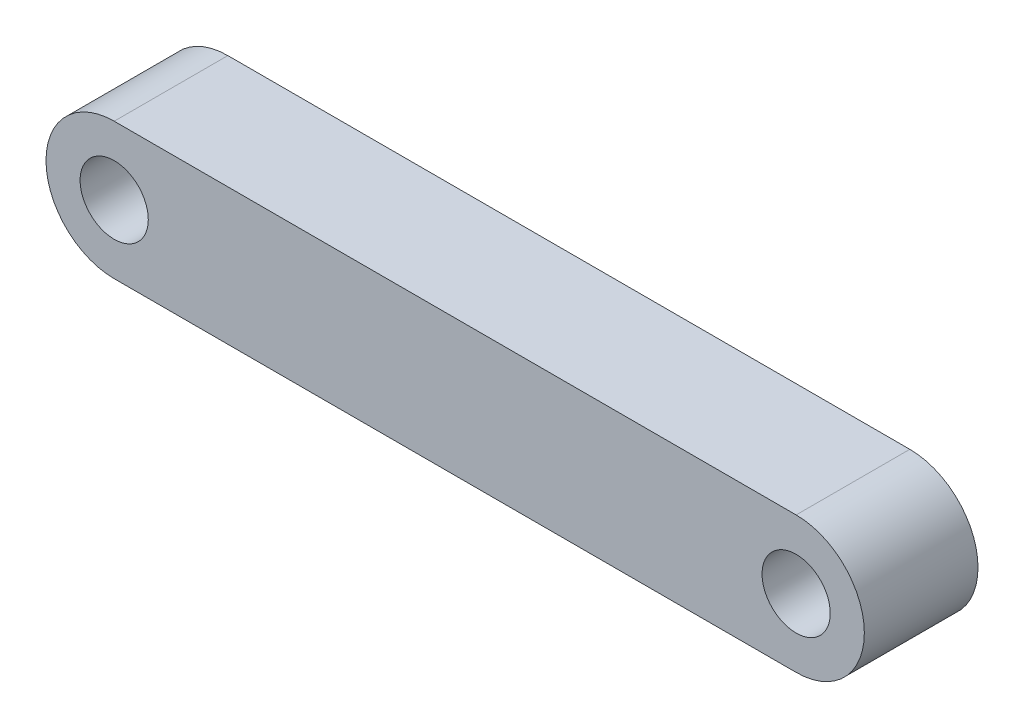
ISO-10303-21;
HEADER;
FILE_DESCRIPTION(('STEP AP214'),'2;1');
FILE_NAME('part.step','',(''),(''),'','','');
FILE_SCHEMA(('AUTOMOTIVE_DESIGN { 1 0 10303 214 1 1 1 1 }'));
ENDSEC;
DATA;
#1=APPLICATION_CONTEXT('core data for automotive mechanical design processes');
#2=APPLICATION_PROTOCOL_DEFINITION('international standard','automotive_design',2000,#1);
#3=PRODUCT_CONTEXT('',#1,'mechanical');
#4=PRODUCT('Part','Part','',(#3));
#5=PRODUCT_RELATED_PRODUCT_CATEGORY('part','',(#4));
#6=PRODUCT_DEFINITION_FORMATION('','',#4);
#7=PRODUCT_DEFINITION_CONTEXT('part definition',#1,'design');
#8=PRODUCT_DEFINITION('design','',#6,#7);
#9=PRODUCT_DEFINITION_SHAPE('','',#8);
#10=(LENGTH_UNIT() NAMED_UNIT(*) SI_UNIT(.MILLI.,.METRE.));
#11=(NAMED_UNIT(*) PLANE_ANGLE_UNIT() SI_UNIT($,.RADIAN.));
#12=(NAMED_UNIT(*) SI_UNIT($,.STERADIAN.) SOLID_ANGLE_UNIT());
#13=UNCERTAINTY_MEASURE_WITH_UNIT(LENGTH_MEASURE(1.E-05),#10,'distance_accuracy_value','');
#14=(GEOMETRIC_REPRESENTATION_CONTEXT(3) GLOBAL_UNCERTAINTY_ASSIGNED_CONTEXT((#13)) GLOBAL_UNIT_ASSIGNED_CONTEXT((#10,
#11,#12)) REPRESENTATION_CONTEXT('',''));
#15=CARTESIAN_POINT('',(0.,0.,0.));
#16=DIRECTION('',(0.,0.,1.));
#17=DIRECTION('',(1.,0.,0.));
#18=AXIS2_PLACEMENT_3D('',#15,#16,#17);
#19=CARTESIAN_POINT('',(-15.,0.,5.));
#20=DIRECTION('',(0.,0.,1.));
#21=DIRECTION('',(1.,0.,0.));
#22=AXIS2_PLACEMENT_3D('',#19,#20,#21);
#23=PLANE('',#22);
#24=CARTESIAN_POINT('',(-15.,0.,5.));
#25=DIRECTION('',(0.,0.,1.));
#26=DIRECTION('',(1.,0.,0.));
#27=AXIS2_PLACEMENT_3D('',#24,#25,#26);
#28=CIRCLE('',#27,1.5);
#29=CARTESIAN_POINT('',(-13.5,0.,5.));
#30=VERTEX_POINT('',#29);
#31=EDGE_CURVE('E100',#30,#30,#28,.T.);
#32=ORIENTED_EDGE('',*,*,#31,.F.);
#33=EDGE_LOOP('',(#32));
#34=FACE_BOUND('',#33,.T.);
#35=CARTESIAN_POINT('',(-15.,0.,5.));
#36=DIRECTION('',(0.,0.,1.));
#37=DIRECTION('',(1.,0.,0.));
#38=AXIS2_PLACEMENT_3D('',#35,#36,#37);
#39=CIRCLE('',#38,3.);
#40=CARTESIAN_POINT('',(-15.,3.,5.));
#41=VERTEX_POINT('',#40);
#42=CARTESIAN_POINT('',(-15.,-3.,5.));
#43=VERTEX_POINT('',#42);
#44=EDGE_CURVE('E85',#41,#43,#39,.T.);
#45=ORIENTED_EDGE('',*,*,#44,.T.);
#46=DIRECTION('',(1.,0.,0.));
#47=VECTOR('',#46,1.);
#48=CARTESIAN_POINT('',(-15.,-3.,5.));
#49=LINE('',#48,#47);
#50=CARTESIAN_POINT('',(15.,-3.,5.));
#51=VERTEX_POINT('',#50);
#52=EDGE_CURVE('E80',#43,#51,#49,.T.);
#53=ORIENTED_EDGE('',*,*,#52,.T.);
#54=CARTESIAN_POINT('',(15.,0.,5.));
#55=DIRECTION('',(0.,0.,1.));
#56=DIRECTION('',(1.,0.,0.));
#57=AXIS2_PLACEMENT_3D('',#54,#55,#56);
#58=CIRCLE('',#57,3.);
#59=CARTESIAN_POINT('',(15.,3.,5.));
#60=VERTEX_POINT('',#59);
#61=EDGE_CURVE('E83',#51,#60,#58,.T.);
#62=ORIENTED_EDGE('',*,*,#61,.T.);
#63=DIRECTION('',(-1.,0.,0.));
#64=VECTOR('',#63,1.);
#65=CARTESIAN_POINT('',(-15.,3.,5.));
#66=LINE('',#65,#64);
#67=EDGE_CURVE('E50',#60,#41,#66,.T.);
#68=ORIENTED_EDGE('',*,*,#67,.T.);
#69=EDGE_LOOP('',(#45,#53,#62,#68));
#70=FACE_BOUND('',#69,.T.);
#71=CARTESIAN_POINT('',(15.,0.,5.));
#72=DIRECTION('',(0.,0.,1.));
#73=DIRECTION('',(1.,0.,0.));
#74=AXIS2_PLACEMENT_3D('',#71,#72,#73);
#75=CIRCLE('',#74,1.5);
#76=CARTESIAN_POINT('',(16.5,0.,5.));
#77=VERTEX_POINT('',#76);
#78=EDGE_CURVE('E115',#77,#77,#75,.T.);
#79=ORIENTED_EDGE('',*,*,#78,.F.);
#80=EDGE_LOOP('',(#79));
#81=FACE_BOUND('',#80,.T.);
#82=ADVANCED_FACE('F33',(#34,#70,#81),#23,.T.);
#83=CARTESIAN_POINT('',(-15.,0.,0.));
#84=DIRECTION('',(0.,0.,1.));
#85=DIRECTION('',(1.,0.,0.));
#86=AXIS2_PLACEMENT_3D('',#83,#84,#85);
#87=PLANE('',#86);
#88=CARTESIAN_POINT('',(-15.,0.,0.));
#89=DIRECTION('',(0.,0.,1.));
#90=DIRECTION('',(1.,0.,0.));
#91=AXIS2_PLACEMENT_3D('',#88,#89,#90);
#92=CIRCLE('',#91,3.);
#93=CARTESIAN_POINT('',(-15.,3.,0.));
#94=VERTEX_POINT('',#93);
#95=CARTESIAN_POINT('',(-15.,-3.,0.));
#96=VERTEX_POINT('',#95);
#97=EDGE_CURVE('E97',#94,#96,#92,.T.);
#98=ORIENTED_EDGE('',*,*,#97,.F.);
#99=DIRECTION('',(-1.,0.,0.));
#100=VECTOR('',#99,1.);
#101=CARTESIAN_POINT('',(-15.,3.,0.));
#102=LINE('',#101,#100);
#103=CARTESIAN_POINT('',(15.,3.,0.));
#104=VERTEX_POINT('',#103);
#105=EDGE_CURVE('E73',#104,#94,#102,.T.);
#106=ORIENTED_EDGE('',*,*,#105,.F.);
#107=CARTESIAN_POINT('',(15.,0.,0.));
#108=DIRECTION('',(0.,0.,1.));
#109=DIRECTION('',(1.,0.,0.));
#110=AXIS2_PLACEMENT_3D('',#107,#108,#109);
#111=CIRCLE('',#110,3.);
#112=CARTESIAN_POINT('',(15.,-3.,0.));
#113=VERTEX_POINT('',#112);
#114=EDGE_CURVE('E67',#113,#104,#111,.T.);
#115=ORIENTED_EDGE('',*,*,#114,.F.);
#116=DIRECTION('',(1.,0.,0.));
#117=VECTOR('',#116,1.);
#118=CARTESIAN_POINT('',(-15.,-3.,0.));
#119=LINE('',#118,#117);
#120=EDGE_CURVE('E89',#96,#113,#119,.T.);
#121=ORIENTED_EDGE('',*,*,#120,.F.);
#122=EDGE_LOOP('',(#98,#106,#115,#121));
#123=FACE_BOUND('',#122,.T.);
#124=CARTESIAN_POINT('',(-15.,0.,0.));
#125=DIRECTION('',(0.,0.,1.));
#126=DIRECTION('',(1.,0.,0.));
#127=AXIS2_PLACEMENT_3D('',#124,#125,#126);
#128=CIRCLE('',#127,1.5);
#129=CARTESIAN_POINT('',(-13.5,0.,0.));
#130=VERTEX_POINT('',#129);
#131=EDGE_CURVE('E112',#130,#130,#128,.T.);
#132=ORIENTED_EDGE('',*,*,#131,.T.);
#133=EDGE_LOOP('',(#132));
#134=FACE_BOUND('',#133,.T.);
#135=CARTESIAN_POINT('',(15.,0.,0.));
#136=DIRECTION('',(0.,0.,1.));
#137=DIRECTION('',(1.,0.,0.));
#138=AXIS2_PLACEMENT_3D('',#135,#136,#137);
#139=CIRCLE('',#138,1.5);
#140=CARTESIAN_POINT('',(16.5,0.,0.));
#141=VERTEX_POINT('',#140);
#142=EDGE_CURVE('E118',#141,#141,#139,.T.);
#143=ORIENTED_EDGE('',*,*,#142,.T.);
#144=EDGE_LOOP('',(#143));
#145=FACE_BOUND('',#144,.T.);
#146=ADVANCED_FACE('F108',(#123,#134,#145),#87,.F.);
#147=CARTESIAN_POINT('',(-15.,0.,5.));
#148=DIRECTION('',(0.,0.,-1.));
#149=DIRECTION('',(-1.,0.,0.));
#150=AXIS2_PLACEMENT_3D('',#147,#148,#149);
#151=CYLINDRICAL_SURFACE('',#150,3.);
#152=ORIENTED_EDGE('',*,*,#97,.T.);
#153=DIRECTION('',(0.,0.,-1.));
#154=VECTOR('',#153,1.);
#155=CARTESIAN_POINT('',(-15.,-3.,5.));
#156=LINE('',#155,#154);
#157=EDGE_CURVE('E11',#43,#96,#156,.T.);
#158=ORIENTED_EDGE('',*,*,#157,.F.);
#159=ORIENTED_EDGE('',*,*,#44,.F.);
#160=DIRECTION('',(0.,0.,-1.));
#161=VECTOR('',#160,1.);
#162=CARTESIAN_POINT('',(-15.,3.,5.));
#163=LINE('',#162,#161);
#164=EDGE_CURVE('E93',#41,#94,#163,.T.);
#165=ORIENTED_EDGE('',*,*,#164,.T.);
#166=EDGE_LOOP('',(#152,#158,#159,#165));
#167=FACE_BOUND('',#166,.T.);
#168=ADVANCED_FACE('F35',(#167),#151,.T.);
#169=CARTESIAN_POINT('',(-15.,-3.,5.));
#170=DIRECTION('',(0.,1.,0.));
#171=DIRECTION('',(0.,0.,1.));
#172=AXIS2_PLACEMENT_3D('',#169,#170,#171);
#173=PLANE('',#172);
#174=ORIENTED_EDGE('',*,*,#120,.T.);
#175=DIRECTION('',(0.,0.,-1.));
#176=VECTOR('',#175,1.);
#177=CARTESIAN_POINT('',(15.,-3.,5.));
#178=LINE('',#177,#176);
#179=EDGE_CURVE('E42',#51,#113,#178,.T.);
#180=ORIENTED_EDGE('',*,*,#179,.F.);
#181=ORIENTED_EDGE('',*,*,#52,.F.);
#182=ORIENTED_EDGE('',*,*,#157,.T.);
#183=EDGE_LOOP('',(#174,#180,#181,#182));
#184=FACE_BOUND('',#183,.T.);
#185=ADVANCED_FACE('F88',(#184),#173,.F.);
#186=CARTESIAN_POINT('',(15.,0.,5.));
#187=DIRECTION('',(0.,0.,-1.));
#188=DIRECTION('',(-1.,0.,0.));
#189=AXIS2_PLACEMENT_3D('',#186,#187,#188);
#190=CYLINDRICAL_SURFACE('',#189,3.);
#191=ORIENTED_EDGE('',*,*,#114,.T.);
#192=DIRECTION('',(0.,0.,-1.));
#193=VECTOR('',#192,1.);
#194=CARTESIAN_POINT('',(15.,3.,5.));
#195=LINE('',#194,#193);
#196=EDGE_CURVE('E90',#60,#104,#195,.T.);
#197=ORIENTED_EDGE('',*,*,#196,.F.);
#198=ORIENTED_EDGE('',*,*,#61,.F.);
#199=ORIENTED_EDGE('',*,*,#179,.T.);
#200=EDGE_LOOP('',(#191,#197,#198,#199));
#201=FACE_BOUND('',#200,.T.);
#202=ADVANCED_FACE('F91',(#201),#190,.T.);
#203=CARTESIAN_POINT('',(-15.,3.,5.));
#204=DIRECTION('',(0.,-1.,0.));
#205=DIRECTION('',(0.,0.,-1.));
#206=AXIS2_PLACEMENT_3D('',#203,#204,#205);
#207=PLANE('',#206);
#208=ORIENTED_EDGE('',*,*,#105,.T.);
#209=ORIENTED_EDGE('',*,*,#164,.F.);
#210=ORIENTED_EDGE('',*,*,#67,.F.);
#211=ORIENTED_EDGE('',*,*,#196,.T.);
#212=EDGE_LOOP('',(#208,#209,#210,#211));
#213=FACE_BOUND('',#212,.T.);
#214=ADVANCED_FACE('F105',(#213),#207,.F.);
#215=CARTESIAN_POINT('',(-15.,0.,5.));
#216=DIRECTION('',(0.,0.,-1.));
#217=DIRECTION('',(-1.,0.,0.));
#218=AXIS2_PLACEMENT_3D('',#215,#216,#217);
#219=CYLINDRICAL_SURFACE('',#218,1.5);
#220=ORIENTED_EDGE('',*,*,#31,.T.);
#221=EDGE_LOOP('',(#220));
#222=FACE_BOUND('',#221,.T.);
#223=ORIENTED_EDGE('',*,*,#131,.F.);
#224=EDGE_LOOP('',(#223));
#225=FACE_BOUND('',#224,.T.);
#226=ADVANCED_FACE('F135',(#222,#225),#219,.F.);
#227=CARTESIAN_POINT('',(15.,0.,5.));
#228=DIRECTION('',(0.,0.,-1.));
#229=DIRECTION('',(-1.,0.,0.));
#230=AXIS2_PLACEMENT_3D('',#227,#228,#229);
#231=CYLINDRICAL_SURFACE('',#230,1.5);
#232=ORIENTED_EDGE('',*,*,#78,.T.);
#233=EDGE_LOOP('',(#232));
#234=FACE_BOUND('',#233,.T.);
#235=ORIENTED_EDGE('',*,*,#142,.F.);
#236=EDGE_LOOP('',(#235));
#237=FACE_BOUND('',#236,.T.);
#238=ADVANCED_FACE('F124',(#234,#237),#231,.F.);
#239=CLOSED_SHELL('',(#82,#146,#168,#185,#202,#214,#226,#238));
#240=MANIFOLD_SOLID_BREP('B2',#239);
#241=ADVANCED_BREP_SHAPE_REPRESENTATION('',(#18,#240),#14);
#242=SHAPE_DEFINITION_REPRESENTATION(#9,#241);
ENDSEC;
END-ISO-10303-21;
